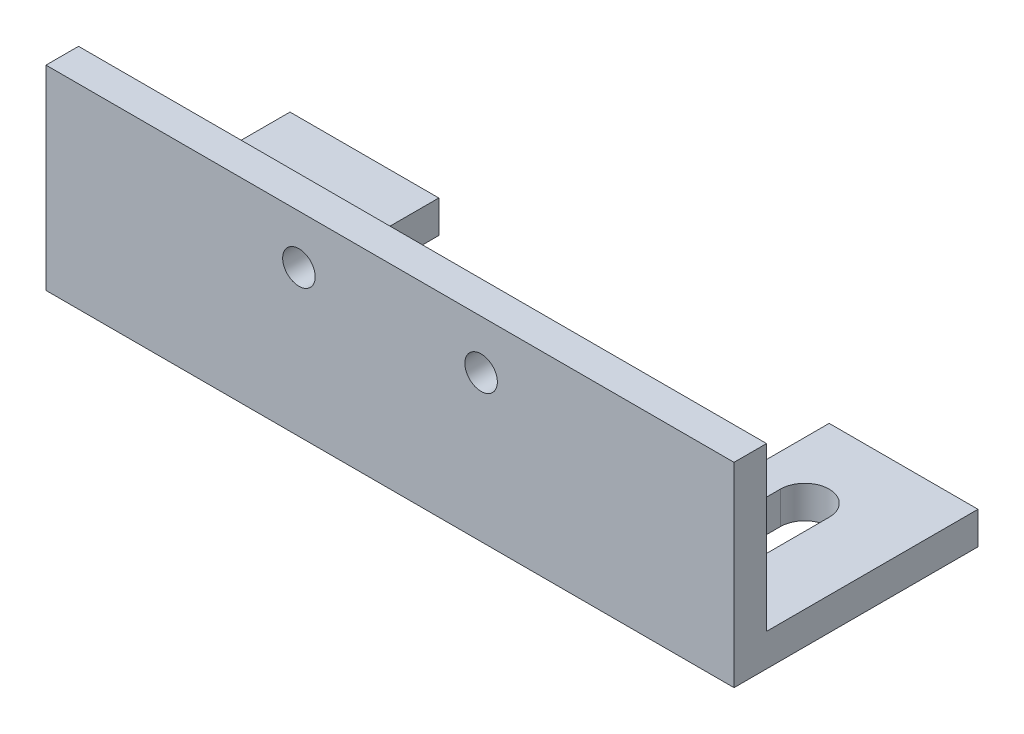
ISO-10303-21;
HEADER;
FILE_DESCRIPTION(('STEP AP214'),'2;1');
FILE_NAME('part.step','',(''),(''),'','','');
FILE_SCHEMA(('AUTOMOTIVE_DESIGN { 1 0 10303 214 1 1 1 1 }'));
ENDSEC;
DATA;
#1=APPLICATION_CONTEXT('core data for automotive mechanical design processes');
#2=APPLICATION_PROTOCOL_DEFINITION('international standard','automotive_design',2000,#1);
#3=PRODUCT_CONTEXT('',#1,'mechanical');
#4=PRODUCT('Part','Part','',(#3));
#5=PRODUCT_RELATED_PRODUCT_CATEGORY('part','',(#4));
#6=PRODUCT_DEFINITION_FORMATION('','',#4);
#7=PRODUCT_DEFINITION_CONTEXT('part definition',#1,'design');
#8=PRODUCT_DEFINITION('design','',#6,#7);
#9=PRODUCT_DEFINITION_SHAPE('','',#8);
#10=(LENGTH_UNIT() NAMED_UNIT(*) SI_UNIT(.MILLI.,.METRE.));
#11=(NAMED_UNIT(*) PLANE_ANGLE_UNIT() SI_UNIT($,.RADIAN.));
#12=(NAMED_UNIT(*) SI_UNIT($,.STERADIAN.) SOLID_ANGLE_UNIT());
#13=UNCERTAINTY_MEASURE_WITH_UNIT(LENGTH_MEASURE(1.E-05),#10,'distance_accuracy_value','');
#14=(GEOMETRIC_REPRESENTATION_CONTEXT(3) GLOBAL_UNCERTAINTY_ASSIGNED_CONTEXT((#13)) GLOBAL_UNIT_ASSIGNED_CONTEXT((#10,
#11,#12)) REPRESENTATION_CONTEXT('',''));
#15=CARTESIAN_POINT('',(0.,0.,0.));
#16=DIRECTION('',(0.,0.,1.));
#17=DIRECTION('',(1.,0.,0.));
#18=AXIS2_PLACEMENT_3D('',#15,#16,#17);
#19=CARTESIAN_POINT('',(0.,2.,0.));
#20=DIRECTION('',(0.,1.,0.));
#21=DIRECTION('',(0.,0.,1.));
#22=AXIS2_PLACEMENT_3D('',#19,#20,#21);
#23=PLANE('',#22);
#24=DIRECTION('',(0.,0.,1.));
#25=VECTOR('',#24,1.);
#26=CARTESIAN_POINT('',(-17.,2.,-2.5));
#27=LINE('',#26,#25);
#28=CARTESIAN_POINT('',(-17.,2.,-2.5));
#29=VERTEX_POINT('',#28);
#30=CARTESIAN_POINT('',(-17.,2.,2.49999999999999));
#31=VERTEX_POINT('',#30);
#32=EDGE_CURVE('E249',#29,#31,#27,.T.);
#33=ORIENTED_EDGE('',*,*,#32,.F.);
#34=CARTESIAN_POINT('',(-15.5,2.,-2.5));
#35=DIRECTION('',(0.,1.,0.));
#36=DIRECTION('',(0.,0.,1.));
#37=AXIS2_PLACEMENT_3D('',#34,#35,#36);
#38=CIRCLE('',#37,1.5);
#39=CARTESIAN_POINT('',(-14.,2.,-2.5));
#40=VERTEX_POINT('',#39);
#41=EDGE_CURVE('E246',#40,#29,#38,.T.);
#42=ORIENTED_EDGE('',*,*,#41,.F.);
#43=DIRECTION('',(0.,0.,-1.));
#44=VECTOR('',#43,1.);
#45=CARTESIAN_POINT('',(-14.,2.,-2.5));
#46=LINE('',#45,#44);
#47=CARTESIAN_POINT('',(-14.,2.,2.49999999999999));
#48=VERTEX_POINT('',#47);
#49=EDGE_CURVE('E257',#48,#40,#46,.T.);
#50=ORIENTED_EDGE('',*,*,#49,.F.);
#51=CARTESIAN_POINT('',(-15.5,2.,2.49999999999999));
#52=DIRECTION('',(0.,1.,0.));
#53=DIRECTION('',(0.,0.,1.));
#54=AXIS2_PLACEMENT_3D('',#51,#52,#53);
#55=CIRCLE('',#54,1.5);
#56=EDGE_CURVE('E253',#31,#48,#55,.T.);
#57=ORIENTED_EDGE('',*,*,#56,.F.);
#58=EDGE_LOOP('',(#33,#42,#50,#57));
#59=FACE_BOUND('',#58,.T.);
#60=DIRECTION('',(0.,0.,1.));
#61=VECTOR('',#60,1.);
#62=CARTESIAN_POINT('',(14.,2.,-2.5));
#63=LINE('',#62,#61);
#64=CARTESIAN_POINT('',(14.,2.,-2.5));
#65=VERTEX_POINT('',#64);
#66=CARTESIAN_POINT('',(14.,2.,2.49999999999999));
#67=VERTEX_POINT('',#66);
#68=EDGE_CURVE('E206',#65,#67,#63,.T.);
#69=ORIENTED_EDGE('',*,*,#68,.F.);
#70=CARTESIAN_POINT('',(15.5,2.,-2.5));
#71=DIRECTION('',(0.,1.,0.));
#72=DIRECTION('',(0.,0.,1.));
#73=AXIS2_PLACEMENT_3D('',#70,#71,#72);
#74=CIRCLE('',#73,1.5);
#75=CARTESIAN_POINT('',(17.,2.,-2.5));
#76=VERTEX_POINT('',#75);
#77=EDGE_CURVE('E203',#76,#65,#74,.T.);
#78=ORIENTED_EDGE('',*,*,#77,.F.);
#79=DIRECTION('',(0.,0.,-1.));
#80=VECTOR('',#79,1.);
#81=CARTESIAN_POINT('',(17.,2.,-2.5));
#82=LINE('',#81,#80);
#83=CARTESIAN_POINT('',(17.,2.,2.49999999999999));
#84=VERTEX_POINT('',#83);
#85=EDGE_CURVE('E214',#84,#76,#82,.T.);
#86=ORIENTED_EDGE('',*,*,#85,.F.);
#87=CARTESIAN_POINT('',(15.5,2.,2.49999999999999));
#88=DIRECTION('',(0.,1.,0.));
#89=DIRECTION('',(0.,0.,1.));
#90=AXIS2_PLACEMENT_3D('',#87,#88,#89);
#91=CIRCLE('',#90,1.5);
#92=EDGE_CURVE('E210',#67,#84,#91,.T.);
#93=ORIENTED_EDGE('',*,*,#92,.F.);
#94=EDGE_LOOP('',(#69,#78,#86,#93));
#95=FACE_BOUND('',#94,.T.);
#96=DIRECTION('',(0.,0.,1.));
#97=VECTOR('',#96,1.);
#98=CARTESIAN_POINT('',(-21.15,2.,-7.5));
#99=LINE('',#98,#97);
#100=CARTESIAN_POINT('',(-21.15,2.,-7.5));
#101=VERTEX_POINT('',#100);
#102=CARTESIAN_POINT('',(-21.15,2.,5.5));
#103=VERTEX_POINT('',#102);
#104=EDGE_CURVE('E60',#101,#103,#99,.T.);
#105=ORIENTED_EDGE('',*,*,#104,.T.);
#106=DIRECTION('',(1.,0.,0.));
#107=VECTOR('',#106,1.);
#108=CARTESIAN_POINT('',(0.,2.,5.5));
#109=LINE('',#108,#107);
#110=CARTESIAN_POINT('',(21.15,2.,5.5));
#111=VERTEX_POINT('',#110);
#112=EDGE_CURVE('E55',#103,#111,#109,.T.);
#113=ORIENTED_EDGE('',*,*,#112,.T.);
#114=DIRECTION('',(0.,0.,-1.));
#115=VECTOR('',#114,1.);
#116=CARTESIAN_POINT('',(21.15,2.,-7.5));
#117=LINE('',#116,#115);
#118=CARTESIAN_POINT('',(21.15,2.,-7.5));
#119=VERTEX_POINT('',#118);
#120=EDGE_CURVE('E169',#111,#119,#117,.T.);
#121=ORIENTED_EDGE('',*,*,#120,.T.);
#122=DIRECTION('',(-1.,0.,0.));
#123=VECTOR('',#122,1.);
#124=CARTESIAN_POINT('',(12.,2.,-7.5));
#125=LINE('',#124,#123);
#126=CARTESIAN_POINT('',(12.,2.,-7.5));
#127=VERTEX_POINT('',#126);
#128=EDGE_CURVE('E291',#119,#127,#125,.T.);
#129=ORIENTED_EDGE('',*,*,#128,.T.);
#130=DIRECTION('',(0.,0.,1.));
#131=VECTOR('',#130,1.);
#132=CARTESIAN_POINT('',(12.,2.,-7.5));
#133=LINE('',#132,#131);
#134=CARTESIAN_POINT('',(12.,2.,2.49999999999999));
#135=VERTEX_POINT('',#134);
#136=EDGE_CURVE('E295',#127,#135,#133,.T.);
#137=ORIENTED_EDGE('',*,*,#136,.T.);
#138=DIRECTION('',(-1.,0.,0.));
#139=VECTOR('',#138,1.);
#140=CARTESIAN_POINT('',(12.,2.,2.49999999999999));
#141=LINE('',#140,#139);
#142=CARTESIAN_POINT('',(-12.,2.,2.49999999999999));
#143=VERTEX_POINT('',#142);
#144=EDGE_CURVE('E298',#135,#143,#141,.T.);
#145=ORIENTED_EDGE('',*,*,#144,.T.);
#146=DIRECTION('',(0.,0.,-1.));
#147=VECTOR('',#146,1.);
#148=CARTESIAN_POINT('',(-12.,2.,2.49999999999999));
#149=LINE('',#148,#147);
#150=CARTESIAN_POINT('',(-12.,2.,-7.5));
#151=VERTEX_POINT('',#150);
#152=EDGE_CURVE('E301',#143,#151,#149,.T.);
#153=ORIENTED_EDGE('',*,*,#152,.T.);
#154=DIRECTION('',(-1.,0.,0.));
#155=VECTOR('',#154,1.);
#156=CARTESIAN_POINT('',(-21.15,2.,-7.5));
#157=LINE('',#156,#155);
#158=EDGE_CURVE('E304',#151,#101,#157,.T.);
#159=ORIENTED_EDGE('',*,*,#158,.T.);
#160=EDGE_LOOP('',(#105,#113,#121,#129,#137,#145,#153,#159));
#161=FACE_BOUND('',#160,.T.);
#162=ADVANCED_FACE('F39',(#59,#95,#161),#23,.T.);
#163=CARTESIAN_POINT('',(0.,0.,0.));
#164=DIRECTION('',(0.,1.,0.));
#165=DIRECTION('',(0.,0.,1.));
#166=AXIS2_PLACEMENT_3D('',#163,#164,#165);
#167=PLANE('',#166);
#168=DIRECTION('',(1.,0.,0.));
#169=VECTOR('',#168,1.);
#170=CARTESIAN_POINT('',(-21.15,0.,7.5));
#171=LINE('',#170,#169);
#172=CARTESIAN_POINT('',(-21.15,0.,7.5));
#173=VERTEX_POINT('',#172);
#174=CARTESIAN_POINT('',(21.15,0.,7.5));
#175=VERTEX_POINT('',#174);
#176=EDGE_CURVE('E292',#173,#175,#171,.T.);
#177=ORIENTED_EDGE('',*,*,#176,.F.);
#178=DIRECTION('',(0.,0.,1.));
#179=VECTOR('',#178,1.);
#180=CARTESIAN_POINT('',(-21.15,0.,-7.5));
#181=LINE('',#180,#179);
#182=CARTESIAN_POINT('',(-21.15,0.,-7.5));
#183=VERTEX_POINT('',#182);
#184=EDGE_CURVE('E327',#183,#173,#181,.T.);
#185=ORIENTED_EDGE('',*,*,#184,.F.);
#186=DIRECTION('',(-1.,0.,0.));
#187=VECTOR('',#186,1.);
#188=CARTESIAN_POINT('',(-21.15,0.,-7.5));
#189=LINE('',#188,#187);
#190=CARTESIAN_POINT('',(-12.,0.,-7.5));
#191=VERTEX_POINT('',#190);
#192=EDGE_CURVE('E324',#191,#183,#189,.T.);
#193=ORIENTED_EDGE('',*,*,#192,.F.);
#194=DIRECTION('',(0.,0.,-1.));
#195=VECTOR('',#194,1.);
#196=CARTESIAN_POINT('',(-12.,0.,2.49999999999999));
#197=LINE('',#196,#195);
#198=CARTESIAN_POINT('',(-12.,0.,2.49999999999999));
#199=VERTEX_POINT('',#198);
#200=EDGE_CURVE('E321',#199,#191,#197,.T.);
#201=ORIENTED_EDGE('',*,*,#200,.F.);
#202=DIRECTION('',(-1.,0.,0.));
#203=VECTOR('',#202,1.);
#204=CARTESIAN_POINT('',(12.,0.,2.49999999999999));
#205=LINE('',#204,#203);
#206=CARTESIAN_POINT('',(12.,0.,2.49999999999999));
#207=VERTEX_POINT('',#206);
#208=EDGE_CURVE('E318',#207,#199,#205,.T.);
#209=ORIENTED_EDGE('',*,*,#208,.F.);
#210=DIRECTION('',(0.,0.,1.));
#211=VECTOR('',#210,1.);
#212=CARTESIAN_POINT('',(12.,0.,-7.5));
#213=LINE('',#212,#211);
#214=CARTESIAN_POINT('',(12.,0.,-7.5));
#215=VERTEX_POINT('',#214);
#216=EDGE_CURVE('E315',#215,#207,#213,.T.);
#217=ORIENTED_EDGE('',*,*,#216,.F.);
#218=DIRECTION('',(-1.,0.,0.));
#219=VECTOR('',#218,1.);
#220=CARTESIAN_POINT('',(12.,0.,-7.5));
#221=LINE('',#220,#219);
#222=CARTESIAN_POINT('',(21.15,0.,-7.5));
#223=VERTEX_POINT('',#222);
#224=EDGE_CURVE('E312',#223,#215,#221,.T.);
#225=ORIENTED_EDGE('',*,*,#224,.F.);
#226=DIRECTION('',(0.,0.,-1.));
#227=VECTOR('',#226,1.);
#228=CARTESIAN_POINT('',(21.15,0.,-7.5));
#229=LINE('',#228,#227);
#230=EDGE_CURVE('E288',#175,#223,#229,.T.);
#231=ORIENTED_EDGE('',*,*,#230,.F.);
#232=EDGE_LOOP('',(#177,#185,#193,#201,#209,#217,#225,#231));
#233=FACE_BOUND('',#232,.T.);
#234=CARTESIAN_POINT('',(15.5,0.,-2.5));
#235=DIRECTION('',(0.,1.,0.));
#236=DIRECTION('',(0.,0.,1.));
#237=AXIS2_PLACEMENT_3D('',#234,#235,#236);
#238=CIRCLE('',#237,1.5);
#239=CARTESIAN_POINT('',(17.,0.,-2.5));
#240=VERTEX_POINT('',#239);
#241=CARTESIAN_POINT('',(14.,0.,-2.5));
#242=VERTEX_POINT('',#241);
#243=EDGE_CURVE('E202',#240,#242,#238,.T.);
#244=ORIENTED_EDGE('',*,*,#243,.T.);
#245=DIRECTION('',(0.,0.,1.));
#246=VECTOR('',#245,1.);
#247=CARTESIAN_POINT('',(14.,0.,-2.5));
#248=LINE('',#247,#246);
#249=CARTESIAN_POINT('',(14.,0.,2.49999999999999));
#250=VERTEX_POINT('',#249);
#251=EDGE_CURVE('E221',#242,#250,#248,.T.);
#252=ORIENTED_EDGE('',*,*,#251,.T.);
#253=CARTESIAN_POINT('',(15.5,0.,2.49999999999999));
#254=DIRECTION('',(0.,1.,0.));
#255=DIRECTION('',(0.,0.,1.));
#256=AXIS2_PLACEMENT_3D('',#253,#254,#255);
#257=CIRCLE('',#256,1.5);
#258=CARTESIAN_POINT('',(17.,0.,2.49999999999999));
#259=VERTEX_POINT('',#258);
#260=EDGE_CURVE('E225',#250,#259,#257,.T.);
#261=ORIENTED_EDGE('',*,*,#260,.T.);
#262=DIRECTION('',(0.,0.,-1.));
#263=VECTOR('',#262,1.);
#264=CARTESIAN_POINT('',(17.,0.,-2.5));
#265=LINE('',#264,#263);
#266=EDGE_CURVE('E207',#259,#240,#265,.T.);
#267=ORIENTED_EDGE('',*,*,#266,.T.);
#268=EDGE_LOOP('',(#244,#252,#261,#267));
#269=FACE_BOUND('',#268,.T.);
#270=CARTESIAN_POINT('',(-15.5,0.,-2.5));
#271=DIRECTION('',(0.,1.,0.));
#272=DIRECTION('',(0.,0.,1.));
#273=AXIS2_PLACEMENT_3D('',#270,#271,#272);
#274=CIRCLE('',#273,1.5);
#275=CARTESIAN_POINT('',(-14.,0.,-2.5));
#276=VERTEX_POINT('',#275);
#277=CARTESIAN_POINT('',(-17.,0.,-2.5));
#278=VERTEX_POINT('',#277);
#279=EDGE_CURVE('E245',#276,#278,#274,.T.);
#280=ORIENTED_EDGE('',*,*,#279,.T.);
#281=DIRECTION('',(0.,0.,1.));
#282=VECTOR('',#281,1.);
#283=CARTESIAN_POINT('',(-17.,0.,-2.5));
#284=LINE('',#283,#282);
#285=CARTESIAN_POINT('',(-17.,0.,2.49999999999999));
#286=VERTEX_POINT('',#285);
#287=EDGE_CURVE('E264',#278,#286,#284,.T.);
#288=ORIENTED_EDGE('',*,*,#287,.T.);
#289=CARTESIAN_POINT('',(-15.5,0.,2.49999999999999));
#290=DIRECTION('',(0.,1.,0.));
#291=DIRECTION('',(0.,0.,1.));
#292=AXIS2_PLACEMENT_3D('',#289,#290,#291);
#293=CIRCLE('',#292,1.5);
#294=CARTESIAN_POINT('',(-14.,0.,2.49999999999999));
#295=VERTEX_POINT('',#294);
#296=EDGE_CURVE('E268',#286,#295,#293,.T.);
#297=ORIENTED_EDGE('',*,*,#296,.T.);
#298=DIRECTION('',(0.,0.,-1.));
#299=VECTOR('',#298,1.);
#300=CARTESIAN_POINT('',(-14.,0.,-2.5));
#301=LINE('',#300,#299);
#302=EDGE_CURVE('E250',#295,#276,#301,.T.);
#303=ORIENTED_EDGE('',*,*,#302,.T.);
#304=EDGE_LOOP('',(#280,#288,#297,#303));
#305=FACE_BOUND('',#304,.T.);
#306=ADVANCED_FACE('F367',(#233,#269,#305),#167,.F.);
#307=CARTESIAN_POINT('',(21.15,2.,-7.5));
#308=DIRECTION('',(-1.,0.,0.));
#309=DIRECTION('',(0.,0.,1.));
#310=AXIS2_PLACEMENT_3D('',#307,#308,#309);
#311=PLANE('',#310);
#312=ORIENTED_EDGE('',*,*,#230,.T.);
#313=DIRECTION('',(0.,-1.,0.));
#314=VECTOR('',#313,1.);
#315=CARTESIAN_POINT('',(21.15,2.,-7.5));
#316=LINE('',#315,#314);
#317=EDGE_CURVE('E11',#119,#223,#316,.T.);
#318=ORIENTED_EDGE('',*,*,#317,.F.);
#319=ORIENTED_EDGE('',*,*,#120,.F.);
#320=DIRECTION('',(0.,1.,0.));
#321=VECTOR('',#320,1.);
#322=CARTESIAN_POINT('',(21.15,0.,5.5));
#323=LINE('',#322,#321);
#324=CARTESIAN_POINT('',(21.15,12.,5.5));
#325=VERTEX_POINT('',#324);
#326=EDGE_CURVE('E163',#111,#325,#323,.T.);
#327=ORIENTED_EDGE('',*,*,#326,.T.);
#328=DIRECTION('',(0.,0.,1.));
#329=VECTOR('',#328,1.);
#330=CARTESIAN_POINT('',(21.15,12.,5.5));
#331=LINE('',#330,#329);
#332=CARTESIAN_POINT('',(21.15,12.,7.5));
#333=VERTEX_POINT('',#332);
#334=EDGE_CURVE('E166',#325,#333,#331,.T.);
#335=ORIENTED_EDGE('',*,*,#334,.T.);
#336=DIRECTION('',(0.,-1.,0.));
#337=VECTOR('',#336,1.);
#338=CARTESIAN_POINT('',(21.15,2.,7.5));
#339=LINE('',#338,#337);
#340=EDGE_CURVE('E309',#333,#175,#339,.T.);
#341=ORIENTED_EDGE('',*,*,#340,.T.);
#342=EDGE_LOOP('',(#312,#318,#319,#327,#335,#341));
#343=FACE_BOUND('',#342,.T.);
#344=ADVANCED_FACE('F41',(#343),#311,.F.);
#345=CARTESIAN_POINT('',(12.,2.,-7.5));
#346=DIRECTION('',(0.,0.,1.));
#347=DIRECTION('',(1.,0.,0.));
#348=AXIS2_PLACEMENT_3D('',#345,#346,#347);
#349=PLANE('',#348);
#350=ORIENTED_EDGE('',*,*,#224,.T.);
#351=DIRECTION('',(0.,-1.,0.));
#352=VECTOR('',#351,1.);
#353=CARTESIAN_POINT('',(12.,2.,-7.5));
#354=LINE('',#353,#352);
#355=EDGE_CURVE('E48',#127,#215,#354,.T.);
#356=ORIENTED_EDGE('',*,*,#355,.F.);
#357=ORIENTED_EDGE('',*,*,#128,.F.);
#358=ORIENTED_EDGE('',*,*,#317,.T.);
#359=EDGE_LOOP('',(#350,#356,#357,#358));
#360=FACE_BOUND('',#359,.T.);
#361=ADVANCED_FACE('F382',(#360),#349,.F.);
#362=CARTESIAN_POINT('',(12.,2.,-7.5));
#363=DIRECTION('',(1.,0.,0.));
#364=DIRECTION('',(0.,0.,-1.));
#365=AXIS2_PLACEMENT_3D('',#362,#363,#364);
#366=PLANE('',#365);
#367=ORIENTED_EDGE('',*,*,#216,.T.);
#368=DIRECTION('',(0.,-1.,0.));
#369=VECTOR('',#368,1.);
#370=CARTESIAN_POINT('',(12.,2.,2.49999999999999));
#371=LINE('',#370,#369);
#372=EDGE_CURVE('E350',#135,#207,#371,.T.);
#373=ORIENTED_EDGE('',*,*,#372,.F.);
#374=ORIENTED_EDGE('',*,*,#136,.F.);
#375=ORIENTED_EDGE('',*,*,#355,.T.);
#376=EDGE_LOOP('',(#367,#373,#374,#375));
#377=FACE_BOUND('',#376,.T.);
#378=ADVANCED_FACE('F359',(#377),#366,.F.);
#379=CARTESIAN_POINT('',(12.,2.,2.49999999999999));
#380=DIRECTION('',(0.,0.,1.));
#381=DIRECTION('',(1.,0.,0.));
#382=AXIS2_PLACEMENT_3D('',#379,#380,#381);
#383=PLANE('',#382);
#384=ORIENTED_EDGE('',*,*,#208,.T.);
#385=DIRECTION('',(0.,-1.,0.));
#386=VECTOR('',#385,1.);
#387=CARTESIAN_POINT('',(-12.,2.,2.49999999999999));
#388=LINE('',#387,#386);
#389=EDGE_CURVE('E346',#143,#199,#388,.T.);
#390=ORIENTED_EDGE('',*,*,#389,.F.);
#391=ORIENTED_EDGE('',*,*,#144,.F.);
#392=ORIENTED_EDGE('',*,*,#372,.T.);
#393=EDGE_LOOP('',(#384,#390,#391,#392));
#394=FACE_BOUND('',#393,.T.);
#395=ADVANCED_FACE('F374',(#394),#383,.F.);
#396=CARTESIAN_POINT('',(-12.,2.,2.49999999999999));
#397=DIRECTION('',(-1.,0.,0.));
#398=DIRECTION('',(0.,0.,1.));
#399=AXIS2_PLACEMENT_3D('',#396,#397,#398);
#400=PLANE('',#399);
#401=ORIENTED_EDGE('',*,*,#200,.T.);
#402=DIRECTION('',(0.,-1.,0.));
#403=VECTOR('',#402,1.);
#404=CARTESIAN_POINT('',(-12.,2.,-7.5));
#405=LINE('',#404,#403);
#406=EDGE_CURVE('E342',#151,#191,#405,.T.);
#407=ORIENTED_EDGE('',*,*,#406,.F.);
#408=ORIENTED_EDGE('',*,*,#152,.F.);
#409=ORIENTED_EDGE('',*,*,#389,.T.);
#410=EDGE_LOOP('',(#401,#407,#408,#409));
#411=FACE_BOUND('',#410,.T.);
#412=ADVANCED_FACE('F378',(#411),#400,.F.);
#413=CARTESIAN_POINT('',(-21.15,2.,-7.5));
#414=DIRECTION('',(0.,0.,1.));
#415=DIRECTION('',(1.,0.,0.));
#416=AXIS2_PLACEMENT_3D('',#413,#414,#415);
#417=PLANE('',#416);
#418=ORIENTED_EDGE('',*,*,#192,.T.);
#419=DIRECTION('',(0.,-1.,0.));
#420=VECTOR('',#419,1.);
#421=CARTESIAN_POINT('',(-21.15,2.,-7.5));
#422=LINE('',#421,#420);
#423=EDGE_CURVE('E338',#101,#183,#422,.T.);
#424=ORIENTED_EDGE('',*,*,#423,.F.);
#425=ORIENTED_EDGE('',*,*,#158,.F.);
#426=ORIENTED_EDGE('',*,*,#406,.T.);
#427=EDGE_LOOP('',(#418,#424,#425,#426));
#428=FACE_BOUND('',#427,.T.);
#429=ADVANCED_FACE('F390',(#428),#417,.F.);
#430=CARTESIAN_POINT('',(-21.15,2.,-7.5));
#431=DIRECTION('',(1.,0.,0.));
#432=DIRECTION('',(0.,0.,-1.));
#433=AXIS2_PLACEMENT_3D('',#430,#431,#432);
#434=PLANE('',#433);
#435=DIRECTION('',(0.,-1.,0.));
#436=VECTOR('',#435,1.);
#437=CARTESIAN_POINT('',(-21.15,2.,7.5));
#438=LINE('',#437,#436);
#439=CARTESIAN_POINT('',(-21.15,12.,7.5));
#440=VERTEX_POINT('',#439);
#441=EDGE_CURVE('E334',#440,#173,#438,.T.);
#442=ORIENTED_EDGE('',*,*,#441,.F.);
#443=DIRECTION('',(0.,0.,1.));
#444=VECTOR('',#443,1.);
#445=CARTESIAN_POINT('',(-21.15,12.,5.5));
#446=LINE('',#445,#444);
#447=CARTESIAN_POINT('',(-21.15,12.,5.5));
#448=VERTEX_POINT('',#447);
#449=EDGE_CURVE('E182',#448,#440,#446,.T.);
#450=ORIENTED_EDGE('',*,*,#449,.F.);
#451=DIRECTION('',(0.,-1.,0.));
#452=VECTOR('',#451,1.);
#453=CARTESIAN_POINT('',(-21.15,0.,5.5));
#454=LINE('',#453,#452);
#455=EDGE_CURVE('E183',#448,#103,#454,.T.);
#456=ORIENTED_EDGE('',*,*,#455,.T.);
#457=ORIENTED_EDGE('',*,*,#104,.F.);
#458=ORIENTED_EDGE('',*,*,#423,.T.);
#459=ORIENTED_EDGE('',*,*,#184,.T.);
#460=EDGE_LOOP('',(#442,#450,#456,#457,#458,#459));
#461=FACE_BOUND('',#460,.T.);
#462=ADVANCED_FACE('F388',(#461),#434,.F.);
#463=CARTESIAN_POINT('',(-21.15,2.,7.5));
#464=DIRECTION('',(0.,0.,-1.));
#465=DIRECTION('',(-1.,0.,0.));
#466=AXIS2_PLACEMENT_3D('',#463,#464,#465);
#467=PLANE('',#466);
#468=ORIENTED_EDGE('',*,*,#176,.T.);
#469=ORIENTED_EDGE('',*,*,#340,.F.);
#470=DIRECTION('',(-1.,0.,0.));
#471=VECTOR('',#470,1.);
#472=CARTESIAN_POINT('',(21.15,12.,7.5));
#473=LINE('',#472,#471);
#474=EDGE_CURVE('E174',#333,#440,#473,.T.);
#475=ORIENTED_EDGE('',*,*,#474,.T.);
#476=ORIENTED_EDGE('',*,*,#441,.T.);
#477=EDGE_LOOP('',(#468,#469,#475,#476));
#478=FACE_BOUND('',#477,.T.);
#479=CARTESIAN_POINT('',(5.6,9.,7.5));
#480=DIRECTION('',(0.,0.,1.));
#481=DIRECTION('',(1.,0.,0.));
#482=AXIS2_PLACEMENT_3D('',#479,#480,#481);
#483=CIRCLE('',#482,1.);
#484=CARTESIAN_POINT('',(6.6,9.,7.5));
#485=VERTEX_POINT('',#484);
#486=EDGE_CURVE('E477',#485,#485,#483,.T.);
#487=ORIENTED_EDGE('',*,*,#486,.F.);
#488=EDGE_LOOP('',(#487));
#489=FACE_BOUND('',#488,.T.);
#490=CARTESIAN_POINT('',(-5.6,9.,7.5));
#491=DIRECTION('',(0.,0.,1.));
#492=DIRECTION('',(1.,0.,0.));
#493=AXIS2_PLACEMENT_3D('',#490,#491,#492);
#494=CIRCLE('',#493,1.);
#495=CARTESIAN_POINT('',(-4.6,9.,7.5));
#496=VERTEX_POINT('',#495);
#497=EDGE_CURVE('E481',#496,#496,#494,.T.);
#498=ORIENTED_EDGE('',*,*,#497,.F.);
#499=EDGE_LOOP('',(#498));
#500=FACE_BOUND('',#499,.T.);
#501=ADVANCED_FACE('F385',(#478,#489,#500),#467,.F.);
#502=CARTESIAN_POINT('',(-15.5,2.,-2.5));
#503=DIRECTION('',(0.,-1.,0.));
#504=DIRECTION('',(0.,0.,-1.));
#505=AXIS2_PLACEMENT_3D('',#502,#503,#504);
#506=CYLINDRICAL_SURFACE('',#505,1.5);
#507=ORIENTED_EDGE('',*,*,#279,.F.);
#508=DIRECTION('',(0.,-1.,0.));
#509=VECTOR('',#508,1.);
#510=CARTESIAN_POINT('',(-14.,2.,-2.5));
#511=LINE('',#510,#509);
#512=EDGE_CURVE('E260',#40,#276,#511,.T.);
#513=ORIENTED_EDGE('',*,*,#512,.F.);
#514=ORIENTED_EDGE('',*,*,#41,.T.);
#515=DIRECTION('',(0.,-1.,0.));
#516=VECTOR('',#515,1.);
#517=CARTESIAN_POINT('',(-17.,2.,-2.5));
#518=LINE('',#517,#516);
#519=EDGE_CURVE('E284',#29,#278,#518,.T.);
#520=ORIENTED_EDGE('',*,*,#519,.T.);
#521=EDGE_LOOP('',(#507,#513,#514,#520));
#522=FACE_BOUND('',#521,.T.);
#523=ADVANCED_FACE('F409',(#522),#506,.F.);
#524=CARTESIAN_POINT('',(-17.,2.,-2.5));
#525=DIRECTION('',(1.,0.,0.));
#526=DIRECTION('',(0.,0.,-1.));
#527=AXIS2_PLACEMENT_3D('',#524,#525,#526);
#528=PLANE('',#527);
#529=ORIENTED_EDGE('',*,*,#287,.F.);
#530=ORIENTED_EDGE('',*,*,#519,.F.);
#531=ORIENTED_EDGE('',*,*,#32,.T.);
#532=DIRECTION('',(0.,-1.,0.));
#533=VECTOR('',#532,1.);
#534=CARTESIAN_POINT('',(-17.,2.,2.49999999999999));
#535=LINE('',#534,#533);
#536=EDGE_CURVE('E281',#31,#286,#535,.T.);
#537=ORIENTED_EDGE('',*,*,#536,.T.);
#538=EDGE_LOOP('',(#529,#530,#531,#537));
#539=FACE_BOUND('',#538,.T.);
#540=ADVANCED_FACE('F416',(#539),#528,.T.);
#541=CARTESIAN_POINT('',(-15.5,2.,2.49999999999999));
#542=DIRECTION('',(0.,-1.,0.));
#543=DIRECTION('',(0.,0.,-1.));
#544=AXIS2_PLACEMENT_3D('',#541,#542,#543);
#545=CYLINDRICAL_SURFACE('',#544,1.5);
#546=ORIENTED_EDGE('',*,*,#296,.F.);
#547=ORIENTED_EDGE('',*,*,#536,.F.);
#548=ORIENTED_EDGE('',*,*,#56,.T.);
#549=DIRECTION('',(0.,-1.,0.));
#550=VECTOR('',#549,1.);
#551=CARTESIAN_POINT('',(-14.,2.,2.49999999999999));
#552=LINE('',#551,#550);
#553=EDGE_CURVE('E278',#48,#295,#552,.T.);
#554=ORIENTED_EDGE('',*,*,#553,.T.);
#555=EDGE_LOOP('',(#546,#547,#548,#554));
#556=FACE_BOUND('',#555,.T.);
#557=ADVANCED_FACE('F421',(#556),#545,.F.);
#558=CARTESIAN_POINT('',(-14.,2.,-2.5));
#559=DIRECTION('',(-1.,0.,0.));
#560=DIRECTION('',(0.,0.,1.));
#561=AXIS2_PLACEMENT_3D('',#558,#559,#560);
#562=PLANE('',#561);
#563=ORIENTED_EDGE('',*,*,#302,.F.);
#564=ORIENTED_EDGE('',*,*,#553,.F.);
#565=ORIENTED_EDGE('',*,*,#49,.T.);
#566=ORIENTED_EDGE('',*,*,#512,.T.);
#567=EDGE_LOOP('',(#563,#564,#565,#566));
#568=FACE_BOUND('',#567,.T.);
#569=ADVANCED_FACE('F429',(#568),#562,.T.);
#570=CARTESIAN_POINT('',(15.5,2.,-2.5));
#571=DIRECTION('',(0.,-1.,0.));
#572=DIRECTION('',(0.,0.,-1.));
#573=AXIS2_PLACEMENT_3D('',#570,#571,#572);
#574=CYLINDRICAL_SURFACE('',#573,1.5);
#575=ORIENTED_EDGE('',*,*,#243,.F.);
#576=DIRECTION('',(0.,-1.,0.));
#577=VECTOR('',#576,1.);
#578=CARTESIAN_POINT('',(17.,2.,-2.5));
#579=LINE('',#578,#577);
#580=EDGE_CURVE('E217',#76,#240,#579,.T.);
#581=ORIENTED_EDGE('',*,*,#580,.F.);
#582=ORIENTED_EDGE('',*,*,#77,.T.);
#583=DIRECTION('',(0.,-1.,0.));
#584=VECTOR('',#583,1.);
#585=CARTESIAN_POINT('',(14.,2.,-2.5));
#586=LINE('',#585,#584);
#587=EDGE_CURVE('E241',#65,#242,#586,.T.);
#588=ORIENTED_EDGE('',*,*,#587,.T.);
#589=EDGE_LOOP('',(#575,#581,#582,#588));
#590=FACE_BOUND('',#589,.T.);
#591=ADVANCED_FACE('F440',(#590),#574,.F.);
#592=CARTESIAN_POINT('',(14.,2.,-2.5));
#593=DIRECTION('',(1.,0.,0.));
#594=DIRECTION('',(0.,0.,-1.));
#595=AXIS2_PLACEMENT_3D('',#592,#593,#594);
#596=PLANE('',#595);
#597=ORIENTED_EDGE('',*,*,#251,.F.);
#598=ORIENTED_EDGE('',*,*,#587,.F.);
#599=ORIENTED_EDGE('',*,*,#68,.T.);
#600=DIRECTION('',(0.,-1.,0.));
#601=VECTOR('',#600,1.);
#602=CARTESIAN_POINT('',(14.,2.,2.49999999999999));
#603=LINE('',#602,#601);
#604=EDGE_CURVE('E238',#67,#250,#603,.T.);
#605=ORIENTED_EDGE('',*,*,#604,.T.);
#606=EDGE_LOOP('',(#597,#598,#599,#605));
#607=FACE_BOUND('',#606,.T.);
#608=ADVANCED_FACE('F445',(#607),#596,.T.);
#609=CARTESIAN_POINT('',(15.5,2.,2.49999999999999));
#610=DIRECTION('',(0.,-1.,0.));
#611=DIRECTION('',(0.,0.,-1.));
#612=AXIS2_PLACEMENT_3D('',#609,#610,#611);
#613=CYLINDRICAL_SURFACE('',#612,1.5);
#614=ORIENTED_EDGE('',*,*,#260,.F.);
#615=ORIENTED_EDGE('',*,*,#604,.F.);
#616=ORIENTED_EDGE('',*,*,#92,.T.);
#617=DIRECTION('',(0.,-1.,0.));
#618=VECTOR('',#617,1.);
#619=CARTESIAN_POINT('',(17.,2.,2.49999999999999));
#620=LINE('',#619,#618);
#621=EDGE_CURVE('E235',#84,#259,#620,.T.);
#622=ORIENTED_EDGE('',*,*,#621,.T.);
#623=EDGE_LOOP('',(#614,#615,#616,#622));
#624=FACE_BOUND('',#623,.T.);
#625=ADVANCED_FACE('F449',(#624),#613,.F.);
#626=CARTESIAN_POINT('',(17.,2.,-2.5));
#627=DIRECTION('',(-1.,0.,0.));
#628=DIRECTION('',(0.,0.,1.));
#629=AXIS2_PLACEMENT_3D('',#626,#627,#628);
#630=PLANE('',#629);
#631=ORIENTED_EDGE('',*,*,#266,.F.);
#632=ORIENTED_EDGE('',*,*,#621,.F.);
#633=ORIENTED_EDGE('',*,*,#85,.T.);
#634=ORIENTED_EDGE('',*,*,#580,.T.);
#635=EDGE_LOOP('',(#631,#632,#633,#634));
#636=FACE_BOUND('',#635,.T.);
#637=ADVANCED_FACE('F453',(#636),#630,.T.);
#638=CARTESIAN_POINT('',(21.15,12.,5.5));
#639=DIRECTION('',(0.,1.,0.));
#640=DIRECTION('',(-1.,0.,0.));
#641=AXIS2_PLACEMENT_3D('',#638,#639,#640);
#642=PLANE('',#641);
#643=ORIENTED_EDGE('',*,*,#474,.F.);
#644=ORIENTED_EDGE('',*,*,#334,.F.);
#645=DIRECTION('',(-1.,0.,0.));
#646=VECTOR('',#645,1.);
#647=CARTESIAN_POINT('',(21.15,12.,5.5));
#648=LINE('',#647,#646);
#649=EDGE_CURVE('E173',#325,#448,#648,.T.);
#650=ORIENTED_EDGE('',*,*,#649,.T.);
#651=ORIENTED_EDGE('',*,*,#449,.T.);
#652=EDGE_LOOP('',(#643,#644,#650,#651));
#653=FACE_BOUND('',#652,.T.);
#654=ADVANCED_FACE('F178',(#653),#642,.T.);
#655=CARTESIAN_POINT('',(0.,0.,5.5));
#656=DIRECTION('',(0.,0.,1.));
#657=DIRECTION('',(1.,0.,0.));
#658=AXIS2_PLACEMENT_3D('',#655,#656,#657);
#659=PLANE('',#658);
#660=ORIENTED_EDGE('',*,*,#112,.F.);
#661=ORIENTED_EDGE('',*,*,#455,.F.);
#662=ORIENTED_EDGE('',*,*,#649,.F.);
#663=ORIENTED_EDGE('',*,*,#326,.F.);
#664=EDGE_LOOP('',(#660,#661,#662,#663));
#665=FACE_BOUND('',#664,.T.);
#666=CARTESIAN_POINT('',(5.6,9.,5.5));
#667=DIRECTION('',(0.,0.,1.));
#668=DIRECTION('',(1.,0.,0.));
#669=AXIS2_PLACEMENT_3D('',#666,#667,#668);
#670=CIRCLE('',#669,1.);
#671=CARTESIAN_POINT('',(6.6,9.,5.5));
#672=VERTEX_POINT('',#671);
#673=EDGE_CURVE('E474',#672,#672,#670,.T.);
#674=ORIENTED_EDGE('',*,*,#673,.T.);
#675=EDGE_LOOP('',(#674));
#676=FACE_BOUND('',#675,.T.);
#677=CARTESIAN_POINT('',(-5.6,9.,5.5));
#678=DIRECTION('',(0.,0.,1.));
#679=DIRECTION('',(1.,0.,0.));
#680=AXIS2_PLACEMENT_3D('',#677,#678,#679);
#681=CIRCLE('',#680,1.);
#682=CARTESIAN_POINT('',(-4.6,9.,5.5));
#683=VERTEX_POINT('',#682);
#684=EDGE_CURVE('E197',#683,#683,#681,.T.);
#685=ORIENTED_EDGE('',*,*,#684,.T.);
#686=EDGE_LOOP('',(#685));
#687=FACE_BOUND('',#686,.T.);
#688=ADVANCED_FACE('F186',(#665,#676,#687),#659,.F.);
#689=CARTESIAN_POINT('',(-5.6,9.,5.5));
#690=DIRECTION('',(0.,0.,1.));
#691=DIRECTION('',(1.,0.,0.));
#692=AXIS2_PLACEMENT_3D('',#689,#690,#691);
#693=CYLINDRICAL_SURFACE('',#692,1.);
#694=ORIENTED_EDGE('',*,*,#684,.F.);
#695=EDGE_LOOP('',(#694));
#696=FACE_BOUND('',#695,.T.);
#697=ORIENTED_EDGE('',*,*,#497,.T.);
#698=EDGE_LOOP('',(#697));
#699=FACE_BOUND('',#698,.T.);
#700=ADVANCED_FACE('F462',(#696,#699),#693,.F.);
#701=CARTESIAN_POINT('',(5.6,9.,5.5));
#702=DIRECTION('',(0.,0.,1.));
#703=DIRECTION('',(1.,0.,0.));
#704=AXIS2_PLACEMENT_3D('',#701,#702,#703);
#705=CYLINDRICAL_SURFACE('',#704,1.);
#706=ORIENTED_EDGE('',*,*,#673,.F.);
#707=EDGE_LOOP('',(#706));
#708=FACE_BOUND('',#707,.T.);
#709=ORIENTED_EDGE('',*,*,#486,.T.);
#710=EDGE_LOOP('',(#709));
#711=FACE_BOUND('',#710,.T.);
#712=ADVANCED_FACE('F465',(#708,#711),#705,.F.);
#713=CLOSED_SHELL('',(#162,#306,#344,#361,#378,#395,#412,#429,#462,#501,#523,#540,#557,#569,
#591,#608,#625,#637,#654,#688,#700,#712));
#714=MANIFOLD_SOLID_BREP('B2',#713);
#715=ADVANCED_BREP_SHAPE_REPRESENTATION('',(#18,#714),#14);
#716=SHAPE_DEFINITION_REPRESENTATION(#9,#715);
ENDSEC;
END-ISO-10303-21;
